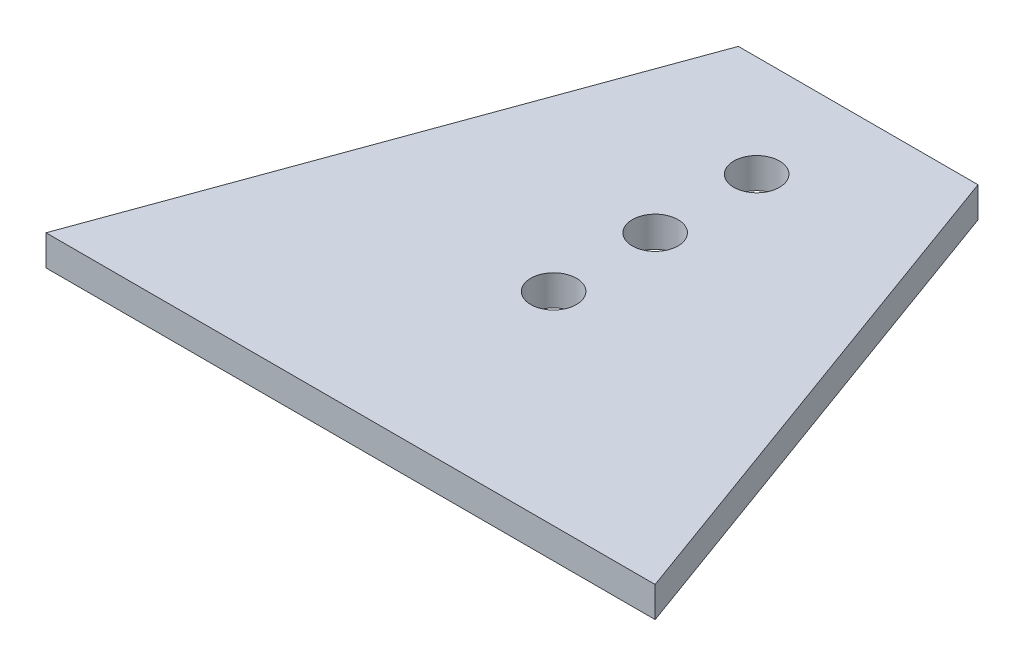
ISO-10303-21;
HEADER;
FILE_DESCRIPTION(('STEP AP214'),'2;1');
FILE_NAME('part.step','',(''),(''),'','','');
FILE_SCHEMA(('AUTOMOTIVE_DESIGN { 1 0 10303 214 1 1 1 1 }'));
ENDSEC;
DATA;
#1=APPLICATION_CONTEXT('core data for automotive mechanical design processes');
#2=APPLICATION_PROTOCOL_DEFINITION('international standard','automotive_design',2000,#1);
#3=PRODUCT_CONTEXT('',#1,'mechanical');
#4=PRODUCT('Part','Part','',(#3));
#5=PRODUCT_RELATED_PRODUCT_CATEGORY('part','',(#4));
#6=PRODUCT_DEFINITION_FORMATION('','',#4);
#7=PRODUCT_DEFINITION_CONTEXT('part definition',#1,'design');
#8=PRODUCT_DEFINITION('design','',#6,#7);
#9=PRODUCT_DEFINITION_SHAPE('','',#8);
#10=(LENGTH_UNIT() NAMED_UNIT(*) SI_UNIT(.MILLI.,.METRE.));
#11=(NAMED_UNIT(*) PLANE_ANGLE_UNIT() SI_UNIT($,.RADIAN.));
#12=(NAMED_UNIT(*) SI_UNIT($,.STERADIAN.) SOLID_ANGLE_UNIT());
#13=UNCERTAINTY_MEASURE_WITH_UNIT(LENGTH_MEASURE(1.E-05),#10,'distance_accuracy_value','');
#14=(GEOMETRIC_REPRESENTATION_CONTEXT(3) GLOBAL_UNCERTAINTY_ASSIGNED_CONTEXT((#13)) GLOBAL_UNIT_ASSIGNED_CONTEXT((#10,
#11,#12)) REPRESENTATION_CONTEXT('',''));
#15=CARTESIAN_POINT('',(0.,0.,0.));
#16=DIRECTION('',(0.,0.,1.));
#17=DIRECTION('',(1.,0.,0.));
#18=AXIS2_PLACEMENT_3D('',#15,#16,#17);
#19=CARTESIAN_POINT('',(0.,3.,0.));
#20=DIRECTION('',(0.,1.,0.));
#21=DIRECTION('',(0.,0.,1.));
#22=AXIS2_PLACEMENT_3D('',#19,#20,#21);
#23=PLANE('',#22);
#24=CARTESIAN_POINT('',(30.,3.,-40.));
#25=DIRECTION('',(0.,1.,0.));
#26=DIRECTION('',(0.,0.,1.));
#27=AXIS2_PLACEMENT_3D('',#24,#25,#26);
#28=CIRCLE('',#27,2.25);
#29=CARTESIAN_POINT('',(30.,3.,-37.75));
#30=VERTEX_POINT('',#29);
#31=EDGE_CURVE('E134',#30,#30,#28,.T.);
#32=ORIENTED_EDGE('',*,*,#31,.F.);
#33=EDGE_LOOP('',(#32));
#34=FACE_BOUND('',#33,.T.);
#35=DIRECTION('',(-0.342020143325673,0.,0.939692620785907));
#36=VECTOR('',#35,1.);
#37=CARTESIAN_POINT('',(18.1985117133104,3.,-50.));
#38=LINE('',#37,#36);
#39=CARTESIAN_POINT('',(18.1985117133104,3.,-50.));
#40=VERTEX_POINT('',#39);
#41=CARTESIAN_POINT('',(0.,3.,0.));
#42=VERTEX_POINT('',#41);
#43=EDGE_CURVE('E92',#40,#42,#38,.T.);
#44=ORIENTED_EDGE('',*,*,#43,.T.);
#45=DIRECTION('',(1.,0.,0.));
#46=VECTOR('',#45,1.);
#47=CARTESIAN_POINT('',(0.,3.,0.));
#48=LINE('',#47,#46);
#49=CARTESIAN_POINT('',(60.,3.,0.));
#50=VERTEX_POINT('',#49);
#51=EDGE_CURVE('E87',#42,#50,#48,.T.);
#52=ORIENTED_EDGE('',*,*,#51,.T.);
#53=DIRECTION('',(-0.342020143325673,0.,-0.939692620785907));
#54=VECTOR('',#53,1.);
#55=CARTESIAN_POINT('',(60.,3.,0.));
#56=LINE('',#55,#54);
#57=CARTESIAN_POINT('',(41.8014882866896,3.,-50.));
#58=VERTEX_POINT('',#57);
#59=EDGE_CURVE('E90',#50,#58,#56,.T.);
#60=ORIENTED_EDGE('',*,*,#59,.T.);
#61=DIRECTION('',(-1.,0.,0.));
#62=VECTOR('',#61,1.);
#63=CARTESIAN_POINT('',(41.8014882866896,3.,-50.));
#64=LINE('',#63,#62);
#65=EDGE_CURVE('E57',#58,#40,#64,.T.);
#66=ORIENTED_EDGE('',*,*,#65,.T.);
#67=EDGE_LOOP('',(#44,#52,#60,#66));
#68=FACE_BOUND('',#67,.T.);
#69=CARTESIAN_POINT('',(30.,3.,-30.));
#70=DIRECTION('',(0.,1.,0.));
#71=DIRECTION('',(0.,0.,1.));
#72=AXIS2_PLACEMENT_3D('',#69,#70,#71);
#73=CIRCLE('',#72,2.25);
#74=CARTESIAN_POINT('',(30.,3.,-27.75));
#75=VERTEX_POINT('',#74);
#76=EDGE_CURVE('E112',#75,#75,#73,.T.);
#77=ORIENTED_EDGE('',*,*,#76,.F.);
#78=EDGE_LOOP('',(#77));
#79=FACE_BOUND('',#78,.T.);
#80=CARTESIAN_POINT('',(30.,3.,-20.));
#81=DIRECTION('',(0.,1.,0.));
#82=DIRECTION('',(0.,0.,1.));
#83=AXIS2_PLACEMENT_3D('',#80,#81,#82);
#84=CIRCLE('',#83,2.25);
#85=CARTESIAN_POINT('',(30.,3.,-17.75));
#86=VERTEX_POINT('',#85);
#87=EDGE_CURVE('E142',#86,#86,#84,.T.);
#88=ORIENTED_EDGE('',*,*,#87,.F.);
#89=EDGE_LOOP('',(#88));
#90=FACE_BOUND('',#89,.T.);
#91=ADVANCED_FACE('F39',(#34,#68,#79,#90),#23,.T.);
#92=CARTESIAN_POINT('',(0.,0.,0.));
#93=DIRECTION('',(0.,1.,0.));
#94=DIRECTION('',(0.,0.,1.));
#95=AXIS2_PLACEMENT_3D('',#92,#93,#94);
#96=PLANE('',#95);
#97=DIRECTION('',(-0.342020143325673,0.,0.939692620785907));
#98=VECTOR('',#97,1.);
#99=CARTESIAN_POINT('',(18.1985117133104,0.,-50.));
#100=LINE('',#99,#98);
#101=CARTESIAN_POINT('',(18.1985117133104,0.,-50.));
#102=VERTEX_POINT('',#101);
#103=CARTESIAN_POINT('',(0.,0.,0.));
#104=VERTEX_POINT('',#103);
#105=EDGE_CURVE('E108',#102,#104,#100,.T.);
#106=ORIENTED_EDGE('',*,*,#105,.F.);
#107=DIRECTION('',(-1.,0.,0.));
#108=VECTOR('',#107,1.);
#109=CARTESIAN_POINT('',(41.8014882866896,0.,-50.));
#110=LINE('',#109,#108);
#111=CARTESIAN_POINT('',(41.8014882866896,0.,-50.));
#112=VERTEX_POINT('',#111);
#113=EDGE_CURVE('E80',#112,#102,#110,.T.);
#114=ORIENTED_EDGE('',*,*,#113,.F.);
#115=DIRECTION('',(-0.342020143325673,0.,-0.939692620785907));
#116=VECTOR('',#115,1.);
#117=CARTESIAN_POINT('',(60.,0.,0.));
#118=LINE('',#117,#116);
#119=CARTESIAN_POINT('',(60.,0.,0.));
#120=VERTEX_POINT('',#119);
#121=EDGE_CURVE('E74',#120,#112,#118,.T.);
#122=ORIENTED_EDGE('',*,*,#121,.F.);
#123=DIRECTION('',(1.,0.,0.));
#124=VECTOR('',#123,1.);
#125=CARTESIAN_POINT('',(0.,0.,0.));
#126=LINE('',#125,#124);
#127=EDGE_CURVE('E97',#104,#120,#126,.T.);
#128=ORIENTED_EDGE('',*,*,#127,.F.);
#129=EDGE_LOOP('',(#106,#114,#122,#128));
#130=FACE_BOUND('',#129,.T.);
#131=CARTESIAN_POINT('',(30.,0.,-30.));
#132=DIRECTION('',(0.,1.,0.));
#133=DIRECTION('',(0.,0.,1.));
#134=AXIS2_PLACEMENT_3D('',#131,#132,#133);
#135=CIRCLE('',#134,2.25);
#136=CARTESIAN_POINT('',(30.,0.,-27.75));
#137=VERTEX_POINT('',#136);
#138=EDGE_CURVE('E130',#137,#137,#135,.T.);
#139=ORIENTED_EDGE('',*,*,#138,.T.);
#140=EDGE_LOOP('',(#139));
#141=FACE_BOUND('',#140,.T.);
#142=CARTESIAN_POINT('',(30.,0.,-40.));
#143=DIRECTION('',(0.,1.,0.));
#144=DIRECTION('',(0.,0.,1.));
#145=AXIS2_PLACEMENT_3D('',#142,#143,#144);
#146=CIRCLE('',#145,2.25);
#147=CARTESIAN_POINT('',(30.,0.,-37.75));
#148=VERTEX_POINT('',#147);
#149=EDGE_CURVE('E138',#148,#148,#146,.T.);
#150=ORIENTED_EDGE('',*,*,#149,.T.);
#151=EDGE_LOOP('',(#150));
#152=FACE_BOUND('',#151,.T.);
#153=CARTESIAN_POINT('',(30.,0.,-20.));
#154=DIRECTION('',(0.,1.,0.));
#155=DIRECTION('',(0.,0.,1.));
#156=AXIS2_PLACEMENT_3D('',#153,#154,#155);
#157=CIRCLE('',#156,2.25);
#158=CARTESIAN_POINT('',(30.,0.,-17.75));
#159=VERTEX_POINT('',#158);
#160=EDGE_CURVE('E146',#159,#159,#157,.T.);
#161=ORIENTED_EDGE('',*,*,#160,.T.);
#162=EDGE_LOOP('',(#161));
#163=FACE_BOUND('',#162,.T.);
#164=ADVANCED_FACE('F125',(#130,#141,#152,#163),#96,.F.);
#165=CARTESIAN_POINT('',(18.1985117133104,3.,-50.));
#166=DIRECTION('',(0.939692620785907,0.,0.342020143325673));
#167=DIRECTION('',(0.342020143325673,0.,-0.939692620785907));
#168=AXIS2_PLACEMENT_3D('',#165,#166,#167);
#169=PLANE('',#168);
#170=ORIENTED_EDGE('',*,*,#105,.T.);
#171=DIRECTION('',(0.,-1.,0.));
#172=VECTOR('',#171,1.);
#173=CARTESIAN_POINT('',(0.,3.,0.));
#174=LINE('',#173,#172);
#175=EDGE_CURVE('E11',#42,#104,#174,.T.);
#176=ORIENTED_EDGE('',*,*,#175,.F.);
#177=ORIENTED_EDGE('',*,*,#43,.F.);
#178=DIRECTION('',(0.,-1.,0.));
#179=VECTOR('',#178,1.);
#180=CARTESIAN_POINT('',(18.1985117133104,3.,-50.));
#181=LINE('',#180,#179);
#182=EDGE_CURVE('E104',#40,#102,#181,.T.);
#183=ORIENTED_EDGE('',*,*,#182,.T.);
#184=EDGE_LOOP('',(#170,#176,#177,#183));
#185=FACE_BOUND('',#184,.T.);
#186=ADVANCED_FACE('F41',(#185),#169,.F.);
#187=CARTESIAN_POINT('',(0.,3.,0.));
#188=DIRECTION('',(0.,0.,-1.));
#189=DIRECTION('',(-1.,0.,0.));
#190=AXIS2_PLACEMENT_3D('',#187,#188,#189);
#191=PLANE('',#190);
#192=ORIENTED_EDGE('',*,*,#127,.T.);
#193=DIRECTION('',(0.,-1.,0.));
#194=VECTOR('',#193,1.);
#195=CARTESIAN_POINT('',(60.,3.,0.));
#196=LINE('',#195,#194);
#197=EDGE_CURVE('E49',#50,#120,#196,.T.);
#198=ORIENTED_EDGE('',*,*,#197,.F.);
#199=ORIENTED_EDGE('',*,*,#51,.F.);
#200=ORIENTED_EDGE('',*,*,#175,.T.);
#201=EDGE_LOOP('',(#192,#198,#199,#200));
#202=FACE_BOUND('',#201,.T.);
#203=ADVANCED_FACE('F96',(#202),#191,.F.);
#204=CARTESIAN_POINT('',(60.,3.,0.));
#205=DIRECTION('',(-0.939692620785907,0.,0.342020143325673));
#206=DIRECTION('',(0.342020143325673,0.,0.939692620785907));
#207=AXIS2_PLACEMENT_3D('',#204,#205,#206);
#208=PLANE('',#207);
#209=ORIENTED_EDGE('',*,*,#121,.T.);
#210=DIRECTION('',(0.,-1.,0.));
#211=VECTOR('',#210,1.);
#212=CARTESIAN_POINT('',(41.8014882866896,3.,-50.));
#213=LINE('',#212,#211);
#214=EDGE_CURVE('E99',#58,#112,#213,.T.);
#215=ORIENTED_EDGE('',*,*,#214,.F.);
#216=ORIENTED_EDGE('',*,*,#59,.F.);
#217=ORIENTED_EDGE('',*,*,#197,.T.);
#218=EDGE_LOOP('',(#209,#215,#216,#217));
#219=FACE_BOUND('',#218,.T.);
#220=ADVANCED_FACE('F100',(#219),#208,.F.);
#221=CARTESIAN_POINT('',(41.8014882866896,3.,-50.));
#222=DIRECTION('',(0.,0.,1.));
#223=DIRECTION('',(1.,0.,0.));
#224=AXIS2_PLACEMENT_3D('',#221,#222,#223);
#225=PLANE('',#224);
#226=ORIENTED_EDGE('',*,*,#113,.T.);
#227=ORIENTED_EDGE('',*,*,#182,.F.);
#228=ORIENTED_EDGE('',*,*,#65,.F.);
#229=ORIENTED_EDGE('',*,*,#214,.T.);
#230=EDGE_LOOP('',(#226,#227,#228,#229));
#231=FACE_BOUND('',#230,.T.);
#232=ADVANCED_FACE('F122',(#231),#225,.F.);
#233=CARTESIAN_POINT('',(30.,3.,-30.));
#234=DIRECTION('',(0.,-1.,0.));
#235=DIRECTION('',(0.,0.,-1.));
#236=AXIS2_PLACEMENT_3D('',#233,#234,#235);
#237=CYLINDRICAL_SURFACE('',#236,2.25);
#238=ORIENTED_EDGE('',*,*,#76,.T.);
#239=EDGE_LOOP('',(#238));
#240=FACE_BOUND('',#239,.T.);
#241=ORIENTED_EDGE('',*,*,#138,.F.);
#242=EDGE_LOOP('',(#241));
#243=FACE_BOUND('',#242,.T.);
#244=ADVANCED_FACE('F166',(#240,#243),#237,.F.);
#245=CARTESIAN_POINT('',(30.,3.,-40.));
#246=DIRECTION('',(0.,-1.,0.));
#247=DIRECTION('',(0.,0.,-1.));
#248=AXIS2_PLACEMENT_3D('',#245,#246,#247);
#249=CYLINDRICAL_SURFACE('',#248,2.25);
#250=ORIENTED_EDGE('',*,*,#31,.T.);
#251=EDGE_LOOP('',(#250));
#252=FACE_BOUND('',#251,.T.);
#253=ORIENTED_EDGE('',*,*,#149,.F.);
#254=EDGE_LOOP('',(#253));
#255=FACE_BOUND('',#254,.T.);
#256=ADVANCED_FACE('F212',(#252,#255),#249,.F.);
#257=CARTESIAN_POINT('',(30.,3.,-20.));
#258=DIRECTION('',(0.,-1.,0.));
#259=DIRECTION('',(0.,0.,-1.));
#260=AXIS2_PLACEMENT_3D('',#257,#258,#259);
#261=CYLINDRICAL_SURFACE('',#260,2.25);
#262=ORIENTED_EDGE('',*,*,#87,.T.);
#263=EDGE_LOOP('',(#262));
#264=FACE_BOUND('',#263,.T.);
#265=ORIENTED_EDGE('',*,*,#160,.F.);
#266=EDGE_LOOP('',(#265));
#267=FACE_BOUND('',#266,.T.);
#268=ADVANCED_FACE('F154',(#264,#267),#261,.F.);
#269=CLOSED_SHELL('',(#91,#164,#186,#203,#220,#232,#244,#256,#268));
#270=MANIFOLD_SOLID_BREP('B2',#269);
#271=ADVANCED_BREP_SHAPE_REPRESENTATION('',(#18,#270),#14);
#272=SHAPE_DEFINITION_REPRESENTATION(#9,#271);
ENDSEC;
END-ISO-10303-21;
